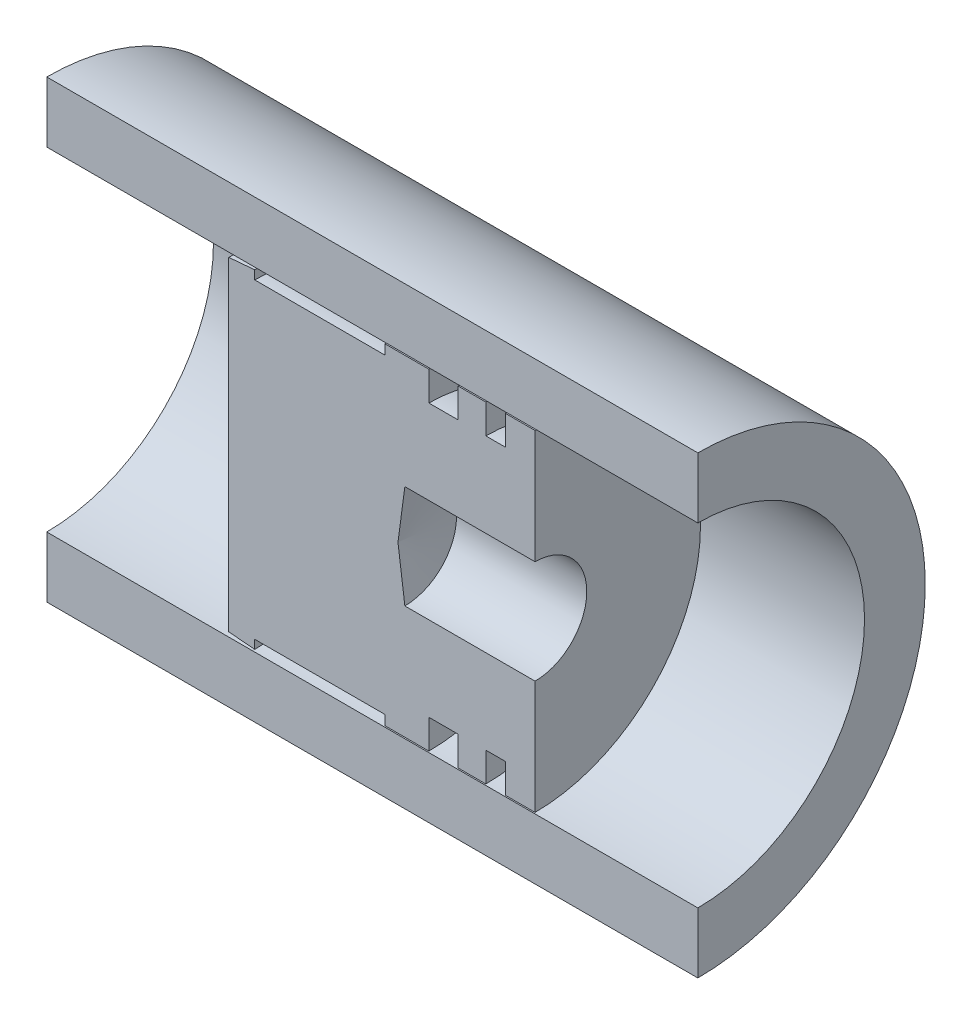
ISO-10303-21;
HEADER;
FILE_DESCRIPTION(('STEP AP214'),'2;1');
FILE_NAME('part.step','',(''),(''),'','','');
FILE_SCHEMA(('AUTOMOTIVE_DESIGN { 1 0 10303 214 1 1 1 1 }'));
ENDSEC;
DATA;
#1=APPLICATION_CONTEXT('core data for automotive mechanical design processes');
#2=APPLICATION_PROTOCOL_DEFINITION('international standard','automotive_design',2000,#1);
#3=PRODUCT_CONTEXT('',#1,'mechanical');
#4=PRODUCT('Part','Part','',(#3));
#5=PRODUCT_RELATED_PRODUCT_CATEGORY('part','',(#4));
#6=PRODUCT_DEFINITION_FORMATION('','',#4);
#7=PRODUCT_DEFINITION_CONTEXT('part definition',#1,'design');
#8=PRODUCT_DEFINITION('design','',#6,#7);
#9=PRODUCT_DEFINITION_SHAPE('','',#8);
#10=(LENGTH_UNIT() NAMED_UNIT(*) SI_UNIT(.MILLI.,.METRE.));
#11=(NAMED_UNIT(*) PLANE_ANGLE_UNIT() SI_UNIT($,.RADIAN.));
#12=(NAMED_UNIT(*) SI_UNIT($,.STERADIAN.) SOLID_ANGLE_UNIT());
#13=UNCERTAINTY_MEASURE_WITH_UNIT(LENGTH_MEASURE(1.E-05),#10,'distance_accuracy_value','');
#14=(GEOMETRIC_REPRESENTATION_CONTEXT(3) GLOBAL_UNCERTAINTY_ASSIGNED_CONTEXT((#13)) GLOBAL_UNIT_ASSIGNED_CONTEXT((#10,
#11,#12)) REPRESENTATION_CONTEXT('',''));
#15=CARTESIAN_POINT('',(0.,0.,0.));
#16=DIRECTION('',(0.,0.,1.));
#17=DIRECTION('',(1.,0.,0.));
#18=AXIS2_PLACEMENT_3D('',#15,#16,#17);
#19=CARTESIAN_POINT('',(-75.,34.925,0.));
#20=DIRECTION('',(1.,0.,0.));
#21=DIRECTION('',(0.,0.,-1.));
#22=AXIS2_PLACEMENT_3D('',#19,#20,#21);
#23=PLANE('',#22);
#24=DIRECTION('',(0.,-1.,0.));
#25=VECTOR('',#24,1.);
#26=CARTESIAN_POINT('',(-75.,34.925,0.));
#27=LINE('',#26,#25);
#28=CARTESIAN_POINT('',(-75.,34.925,0.));
#29=VERTEX_POINT('',#28);
#30=CARTESIAN_POINT('',(-75.,25.6,0.));
#31=VERTEX_POINT('',#30);
#32=EDGE_CURVE('E101',#29,#31,#27,.T.);
#33=ORIENTED_EDGE('',*,*,#32,.F.);
#34=CARTESIAN_POINT('',(-75.,0.,0.));
#35=DIRECTION('',(-1.,0.,0.));
#36=DIRECTION('',(0.,0.,1.));
#37=AXIS2_PLACEMENT_3D('',#34,#35,#36);
#38=CIRCLE('',#37,34.925);
#39=CARTESIAN_POINT('',(-75.,-34.925,0.));
#40=VERTEX_POINT('',#39);
#41=EDGE_CURVE('E98',#29,#40,#38,.T.);
#42=ORIENTED_EDGE('',*,*,#41,.T.);
#43=CARTESIAN_POINT('',(-75.,-25.6,0.));
#44=VERTEX_POINT('',#43);
#45=EDGE_CURVE('E64',#44,#40,#27,.T.);
#46=ORIENTED_EDGE('',*,*,#45,.F.);
#47=CARTESIAN_POINT('',(-75.,0.,0.));
#48=DIRECTION('',(-1.,0.,0.));
#49=DIRECTION('',(0.,0.,1.));
#50=AXIS2_PLACEMENT_3D('',#47,#48,#49);
#51=CIRCLE('',#50,25.6);
#52=EDGE_CURVE('E87',#31,#44,#51,.T.);
#53=ORIENTED_EDGE('',*,*,#52,.F.);
#54=EDGE_LOOP('',(#33,#42,#46,#53));
#55=FACE_BOUND('',#54,.T.);
#56=ADVANCED_FACE('F43',(#55),#23,.F.);
#57=CARTESIAN_POINT('',(-80.,0.,0.));
#58=DIRECTION('',(-1.,0.,0.));
#59=DIRECTION('',(0.,0.,1.));
#60=AXIS2_PLACEMENT_3D('',#57,#58,#59);
#61=CYLINDRICAL_SURFACE('',#60,25.6);
#62=DIRECTION('',(-1.,0.,0.));
#63=VECTOR('',#62,1.);
#64=CARTESIAN_POINT('',(-80.,25.6,0.));
#65=LINE('',#64,#63);
#66=CARTESIAN_POINT('',(25.,25.6,0.));
#67=VERTEX_POINT('',#66);
#68=EDGE_CURVE('E110',#31,#67,#65,.F.);
#69=ORIENTED_EDGE('',*,*,#68,.F.);
#70=ORIENTED_EDGE('',*,*,#52,.T.);
#71=DIRECTION('',(-1.,0.,0.));
#72=VECTOR('',#71,1.);
#73=CARTESIAN_POINT('',(-80.,-25.6,0.));
#74=LINE('',#73,#72);
#75=CARTESIAN_POINT('',(25.,-25.6,0.));
#76=VERTEX_POINT('',#75);
#77=EDGE_CURVE('E95',#76,#44,#74,.T.);
#78=ORIENTED_EDGE('',*,*,#77,.F.);
#79=CARTESIAN_POINT('',(25.,0.,0.));
#80=DIRECTION('',(-1.,0.,0.));
#81=DIRECTION('',(0.,0.,1.));
#82=AXIS2_PLACEMENT_3D('',#79,#80,#81);
#83=CIRCLE('',#82,25.6);
#84=EDGE_CURVE('E94',#67,#76,#83,.T.);
#85=ORIENTED_EDGE('',*,*,#84,.F.);
#86=EDGE_LOOP('',(#69,#70,#78,#85));
#87=FACE_BOUND('',#86,.T.);
#88=ADVANCED_FACE('F109',(#87),#61,.F.);
#89=CARTESIAN_POINT('',(25.,34.925,0.));
#90=DIRECTION('',(-1.,0.,0.));
#91=DIRECTION('',(0.,0.,1.));
#92=AXIS2_PLACEMENT_3D('',#89,#90,#91);
#93=PLANE('',#92);
#94=DIRECTION('',(0.,1.,0.));
#95=VECTOR('',#94,1.);
#96=CARTESIAN_POINT('',(25.,34.925,0.));
#97=LINE('',#96,#95);
#98=CARTESIAN_POINT('',(25.,-34.925,0.));
#99=VERTEX_POINT('',#98);
#100=EDGE_CURVE('E81',#99,#76,#97,.T.);
#101=ORIENTED_EDGE('',*,*,#100,.F.);
#102=CARTESIAN_POINT('',(25.,0.,0.));
#103=DIRECTION('',(-1.,0.,0.));
#104=DIRECTION('',(0.,0.,1.));
#105=AXIS2_PLACEMENT_3D('',#102,#103,#104);
#106=CIRCLE('',#105,34.925);
#107=CARTESIAN_POINT('',(25.,34.925,0.));
#108=VERTEX_POINT('',#107);
#109=EDGE_CURVE('E92',#108,#99,#106,.T.);
#110=ORIENTED_EDGE('',*,*,#109,.F.);
#111=EDGE_CURVE('E56',#67,#108,#97,.T.);
#112=ORIENTED_EDGE('',*,*,#111,.F.);
#113=ORIENTED_EDGE('',*,*,#84,.T.);
#114=EDGE_LOOP('',(#101,#110,#112,#113));
#115=FACE_BOUND('',#114,.T.);
#116=ADVANCED_FACE('F91',(#115),#93,.F.);
#117=CARTESIAN_POINT('',(-80.,0.,0.));
#118=DIRECTION('',(-1.,0.,0.));
#119=DIRECTION('',(0.,0.,1.));
#120=AXIS2_PLACEMENT_3D('',#117,#118,#119);
#121=CYLINDRICAL_SURFACE('',#120,34.925);
#122=DIRECTION('',(-1.,0.,0.));
#123=VECTOR('',#122,1.);
#124=CARTESIAN_POINT('',(-80.,34.925,0.));
#125=LINE('',#124,#123);
#126=EDGE_CURVE('E12',#108,#29,#125,.T.);
#127=ORIENTED_EDGE('',*,*,#126,.F.);
#128=ORIENTED_EDGE('',*,*,#109,.T.);
#129=DIRECTION('',(-1.,0.,0.));
#130=VECTOR('',#129,1.);
#131=CARTESIAN_POINT('',(-80.,-34.925,0.));
#132=LINE('',#131,#130);
#133=EDGE_CURVE('E50',#40,#99,#132,.F.);
#134=ORIENTED_EDGE('',*,*,#133,.F.);
#135=ORIENTED_EDGE('',*,*,#41,.F.);
#136=EDGE_LOOP('',(#127,#128,#134,#135));
#137=FACE_BOUND('',#136,.T.);
#138=ADVANCED_FACE('F97',(#137),#121,.T.);
#139=CARTESIAN_POINT('',(0.,0.,0.));
#140=DIRECTION('',(0.,0.,1.));
#141=DIRECTION('',(1.,0.,0.));
#142=AXIS2_PLACEMENT_3D('',#139,#140,#141);
#143=PLANE('',#142);
#144=ORIENTED_EDGE('',*,*,#45,.T.);
#145=ORIENTED_EDGE('',*,*,#133,.T.);
#146=ORIENTED_EDGE('',*,*,#100,.T.);
#147=ORIENTED_EDGE('',*,*,#77,.T.);
#148=EDGE_LOOP('',(#144,#145,#146,#147));
#149=FACE_BOUND('',#148,.T.);
#150=ADVANCED_FACE('F80',(#149),#143,.T.);
#151=ORIENTED_EDGE('',*,*,#32,.T.);
#152=ORIENTED_EDGE('',*,*,#68,.T.);
#153=ORIENTED_EDGE('',*,*,#111,.T.);
#154=ORIENTED_EDGE('',*,*,#126,.T.);
#155=EDGE_LOOP('',(#151,#152,#153,#154));
#156=FACE_BOUND('',#155,.T.);
#157=ADVANCED_FACE('F115',(#156),#143,.T.);
#158=CLOSED_SHELL('',(#56,#88,#116,#138,#150,#157));
#159=MANIFOLD_SOLID_BREP('B2',#158);
#160=CARTESIAN_POINT('',(-47.06,0.,0.));
#161=DIRECTION('',(1.,0.,0.));
#162=DIRECTION('',(0.,0.,-1.));
#163=AXIS2_PLACEMENT_3D('',#160,#161,#162);
#164=PLANE('',#163);
#165=DIRECTION('',(0.,-1.,0.));
#166=VECTOR('',#165,1.);
#167=CARTESIAN_POINT('',(-47.06,0.,0.));
#168=LINE('',#167,#166);
#169=CARTESIAN_POINT('',(-47.06,24.9,0.));
#170=VERTEX_POINT('',#169);
#171=CARTESIAN_POINT('',(-47.06,-24.9,0.));
#172=VERTEX_POINT('',#171);
#173=EDGE_CURVE('E183',#170,#172,#168,.T.);
#174=ORIENTED_EDGE('',*,*,#173,.F.);
#175=CARTESIAN_POINT('',(-47.06,0.,0.));
#176=DIRECTION('',(-1.,0.,0.));
#177=DIRECTION('',(0.,0.,1.));
#178=AXIS2_PLACEMENT_3D('',#175,#176,#177);
#179=CIRCLE('',#178,24.9);
#180=EDGE_CURVE('E279',#170,#172,#179,.T.);
#181=ORIENTED_EDGE('',*,*,#180,.T.);
#182=EDGE_LOOP('',(#174,#181));
#183=FACE_BOUND('',#182,.T.);
#184=ADVANCED_FACE('F164',(#183),#164,.F.);
#185=CARTESIAN_POINT('',(-43.06,0.,0.));
#186=DIRECTION('',(1.,0.,0.));
#187=DIRECTION('',(0.,0.,-1.));
#188=AXIS2_PLACEMENT_3D('',#185,#186,#187);
#189=CONICAL_SURFACE('',#188,25.25,0.0872777129494621);
#190=DIRECTION('',(0.996193717496113,-0.0871669502809106,0.));
#191=VECTOR('',#190,1.);
#192=CARTESIAN_POINT('',(-331.631428571426,0.,0.));
#193=LINE('',#192,#191);
#194=CARTESIAN_POINT('',(-43.06,-25.25,0.));
#195=VERTEX_POINT('',#194);
#196=EDGE_CURVE('E295',#172,#195,#193,.T.);
#197=ORIENTED_EDGE('',*,*,#196,.F.);
#198=ORIENTED_EDGE('',*,*,#180,.F.);
#199=DIRECTION('',(-0.996193717496113,-0.0871669502809106,0.));
#200=VECTOR('',#199,1.);
#201=CARTESIAN_POINT('',(-331.631428571426,0.,0.));
#202=LINE('',#201,#200);
#203=CARTESIAN_POINT('',(-43.06,25.25,0.));
#204=VERTEX_POINT('',#203);
#205=EDGE_CURVE('E343',#204,#170,#202,.T.);
#206=ORIENTED_EDGE('',*,*,#205,.F.);
#207=CARTESIAN_POINT('',(-43.06,0.,0.));
#208=DIRECTION('',(-1.,0.,0.));
#209=DIRECTION('',(0.,0.,1.));
#210=AXIS2_PLACEMENT_3D('',#207,#208,#209);
#211=CIRCLE('',#210,25.25);
#212=EDGE_CURVE('E334',#204,#195,#211,.T.);
#213=ORIENTED_EDGE('',*,*,#212,.T.);
#214=EDGE_LOOP('',(#197,#198,#206,#213));
#215=FACE_BOUND('',#214,.T.);
#216=ADVANCED_FACE('F342',(#215),#189,.T.);
#217=CARTESIAN_POINT('',(-43.06,25.25,0.));
#218=DIRECTION('',(-1.,0.,0.));
#219=DIRECTION('',(0.,0.,1.));
#220=AXIS2_PLACEMENT_3D('',#217,#218,#219);
#221=PLANE('',#220);
#222=DIRECTION('',(0.,1.,0.));
#223=VECTOR('',#222,1.);
#224=CARTESIAN_POINT('',(-43.06,25.25,0.));
#225=LINE('',#224,#223);
#226=CARTESIAN_POINT('',(-43.06,-23.9,0.));
#227=VERTEX_POINT('',#226);
#228=EDGE_CURVE('E346',#195,#227,#225,.T.);
#229=ORIENTED_EDGE('',*,*,#228,.F.);
#230=ORIENTED_EDGE('',*,*,#212,.F.);
#231=CARTESIAN_POINT('',(-43.06,23.9,0.));
#232=VERTEX_POINT('',#231);
#233=EDGE_CURVE('E349',#232,#204,#225,.T.);
#234=ORIENTED_EDGE('',*,*,#233,.F.);
#235=CARTESIAN_POINT('',(-43.06,0.,0.));
#236=DIRECTION('',(-1.,0.,0.));
#237=DIRECTION('',(0.,0.,1.));
#238=AXIS2_PLACEMENT_3D('',#235,#236,#237);
#239=CIRCLE('',#238,23.9);
#240=EDGE_CURVE('E331',#232,#227,#239,.T.);
#241=ORIENTED_EDGE('',*,*,#240,.T.);
#242=EDGE_LOOP('',(#229,#230,#234,#241));
#243=FACE_BOUND('',#242,.T.);
#244=ADVANCED_FACE('F453',(#243),#221,.F.);
#245=CARTESIAN_POINT('',(-47.06,0.,0.));
#246=DIRECTION('',(-1.,0.,0.));
#247=DIRECTION('',(0.,0.,1.));
#248=AXIS2_PLACEMENT_3D('',#245,#246,#247);
#249=CYLINDRICAL_SURFACE('',#248,23.9);
#250=DIRECTION('',(-1.,0.,0.));
#251=VECTOR('',#250,1.);
#252=CARTESIAN_POINT('',(-47.06,23.9,0.));
#253=LINE('',#252,#251);
#254=CARTESIAN_POINT('',(-23.06,23.9,0.));
#255=VERTEX_POINT('',#254);
#256=EDGE_CURVE('E351',#255,#232,#253,.T.);
#257=ORIENTED_EDGE('',*,*,#256,.F.);
#258=CARTESIAN_POINT('',(-23.06,0.,0.));
#259=DIRECTION('',(-1.,0.,0.));
#260=DIRECTION('',(0.,0.,1.));
#261=AXIS2_PLACEMENT_3D('',#258,#259,#260);
#262=CIRCLE('',#261,23.9);
#263=CARTESIAN_POINT('',(-23.06,-23.9,0.));
#264=VERTEX_POINT('',#263);
#265=EDGE_CURVE('E328',#255,#264,#262,.T.);
#266=ORIENTED_EDGE('',*,*,#265,.T.);
#267=DIRECTION('',(-1.,0.,0.));
#268=VECTOR('',#267,1.);
#269=CARTESIAN_POINT('',(-47.06,-23.9,0.));
#270=LINE('',#269,#268);
#271=EDGE_CURVE('E353',#227,#264,#270,.F.);
#272=ORIENTED_EDGE('',*,*,#271,.F.);
#273=ORIENTED_EDGE('',*,*,#240,.F.);
#274=EDGE_LOOP('',(#257,#266,#272,#273));
#275=FACE_BOUND('',#274,.T.);
#276=ADVANCED_FACE('F450',(#275),#249,.T.);
#277=CARTESIAN_POINT('',(-23.06,25.4,0.));
#278=DIRECTION('',(1.,0.,0.));
#279=DIRECTION('',(0.,0.,-1.));
#280=AXIS2_PLACEMENT_3D('',#277,#278,#279);
#281=PLANE('',#280);
#282=DIRECTION('',(0.,-1.,0.));
#283=VECTOR('',#282,1.);
#284=CARTESIAN_POINT('',(-23.06,25.4,0.));
#285=LINE('',#284,#283);
#286=CARTESIAN_POINT('',(-23.06,25.4,0.));
#287=VERTEX_POINT('',#286);
#288=EDGE_CURVE('E355',#287,#255,#285,.T.);
#289=ORIENTED_EDGE('',*,*,#288,.F.);
#290=CARTESIAN_POINT('',(-23.06,0.,0.));
#291=DIRECTION('',(-1.,0.,0.));
#292=DIRECTION('',(0.,0.,1.));
#293=AXIS2_PLACEMENT_3D('',#290,#291,#292);
#294=CIRCLE('',#293,25.4);
#295=CARTESIAN_POINT('',(-23.06,-25.4,0.));
#296=VERTEX_POINT('',#295);
#297=EDGE_CURVE('E325',#287,#296,#294,.T.);
#298=ORIENTED_EDGE('',*,*,#297,.T.);
#299=EDGE_CURVE('E356',#264,#296,#285,.T.);
#300=ORIENTED_EDGE('',*,*,#299,.F.);
#301=ORIENTED_EDGE('',*,*,#265,.F.);
#302=EDGE_LOOP('',(#289,#298,#300,#301));
#303=FACE_BOUND('',#302,.T.);
#304=ADVANCED_FACE('F444',(#303),#281,.F.);
#305=CARTESIAN_POINT('',(-47.06,0.,0.));
#306=DIRECTION('',(-1.,0.,0.));
#307=DIRECTION('',(0.,0.,1.));
#308=AXIS2_PLACEMENT_3D('',#305,#306,#307);
#309=CYLINDRICAL_SURFACE('',#308,25.4);
#310=DIRECTION('',(-1.,0.,0.));
#311=VECTOR('',#310,1.);
#312=CARTESIAN_POINT('',(-47.06,25.4,0.));
#313=LINE('',#312,#311);
#314=CARTESIAN_POINT('',(-16.31,25.4,0.));
#315=VERTEX_POINT('',#314);
#316=EDGE_CURVE('E358',#315,#287,#313,.T.);
#317=ORIENTED_EDGE('',*,*,#316,.F.);
#318=CARTESIAN_POINT('',(-16.31,0.,0.));
#319=DIRECTION('',(-1.,0.,0.));
#320=DIRECTION('',(0.,0.,1.));
#321=AXIS2_PLACEMENT_3D('',#318,#319,#320);
#322=CIRCLE('',#321,25.4);
#323=CARTESIAN_POINT('',(-16.31,-25.4,0.));
#324=VERTEX_POINT('',#323);
#325=EDGE_CURVE('E322',#315,#324,#322,.T.);
#326=ORIENTED_EDGE('',*,*,#325,.T.);
#327=DIRECTION('',(-1.,0.,0.));
#328=VECTOR('',#327,1.);
#329=CARTESIAN_POINT('',(-47.06,-25.4,0.));
#330=LINE('',#329,#328);
#331=EDGE_CURVE('E360',#296,#324,#330,.F.);
#332=ORIENTED_EDGE('',*,*,#331,.F.);
#333=ORIENTED_EDGE('',*,*,#297,.F.);
#334=EDGE_LOOP('',(#317,#326,#332,#333));
#335=FACE_BOUND('',#334,.T.);
#336=ADVANCED_FACE('F440',(#335),#309,.T.);
#337=CARTESIAN_POINT('',(-16.31,25.4,0.));
#338=DIRECTION('',(-1.,0.,0.));
#339=DIRECTION('',(0.,0.,1.));
#340=AXIS2_PLACEMENT_3D('',#337,#338,#339);
#341=PLANE('',#340);
#342=DIRECTION('',(0.,1.,0.));
#343=VECTOR('',#342,1.);
#344=CARTESIAN_POINT('',(-16.31,25.4,0.));
#345=LINE('',#344,#343);
#346=CARTESIAN_POINT('',(-16.31,-20.9,0.));
#347=VERTEX_POINT('',#346);
#348=EDGE_CURVE('E362',#324,#347,#345,.T.);
#349=ORIENTED_EDGE('',*,*,#348,.F.);
#350=ORIENTED_EDGE('',*,*,#325,.F.);
#351=CARTESIAN_POINT('',(-16.31,20.9,0.));
#352=VERTEX_POINT('',#351);
#353=EDGE_CURVE('E363',#352,#315,#345,.T.);
#354=ORIENTED_EDGE('',*,*,#353,.F.);
#355=CARTESIAN_POINT('',(-16.31,0.,0.));
#356=DIRECTION('',(-1.,0.,0.));
#357=DIRECTION('',(0.,0.,1.));
#358=AXIS2_PLACEMENT_3D('',#355,#356,#357);
#359=CIRCLE('',#358,20.9);
#360=EDGE_CURVE('E319',#352,#347,#359,.T.);
#361=ORIENTED_EDGE('',*,*,#360,.T.);
#362=EDGE_LOOP('',(#349,#350,#354,#361));
#363=FACE_BOUND('',#362,.T.);
#364=ADVANCED_FACE('F434',(#363),#341,.F.);
#365=CARTESIAN_POINT('',(-47.06,0.,0.));
#366=DIRECTION('',(-1.,0.,0.));
#367=DIRECTION('',(0.,0.,1.));
#368=AXIS2_PLACEMENT_3D('',#365,#366,#367);
#369=CYLINDRICAL_SURFACE('',#368,20.9);
#370=DIRECTION('',(-1.,0.,0.));
#371=VECTOR('',#370,1.);
#372=CARTESIAN_POINT('',(-47.06,20.9,0.));
#373=LINE('',#372,#371);
#374=CARTESIAN_POINT('',(-11.81,20.9,0.));
#375=VERTEX_POINT('',#374);
#376=EDGE_CURVE('E365',#375,#352,#373,.T.);
#377=ORIENTED_EDGE('',*,*,#376,.F.);
#378=CARTESIAN_POINT('',(-11.81,0.,0.));
#379=DIRECTION('',(-1.,0.,0.));
#380=DIRECTION('',(0.,0.,1.));
#381=AXIS2_PLACEMENT_3D('',#378,#379,#380);
#382=CIRCLE('',#381,20.9);
#383=CARTESIAN_POINT('',(-11.81,-20.9,0.));
#384=VERTEX_POINT('',#383);
#385=EDGE_CURVE('E316',#375,#384,#382,.T.);
#386=ORIENTED_EDGE('',*,*,#385,.T.);
#387=DIRECTION('',(-1.,0.,0.));
#388=VECTOR('',#387,1.);
#389=CARTESIAN_POINT('',(-47.06,-20.9,0.));
#390=LINE('',#389,#388);
#391=EDGE_CURVE('E367',#347,#384,#390,.F.);
#392=ORIENTED_EDGE('',*,*,#391,.F.);
#393=ORIENTED_EDGE('',*,*,#360,.F.);
#394=EDGE_LOOP('',(#377,#386,#392,#393));
#395=FACE_BOUND('',#394,.T.);
#396=ADVANCED_FACE('F430',(#395),#369,.T.);
#397=CARTESIAN_POINT('',(-11.81,20.9,0.));
#398=DIRECTION('',(1.,0.,0.));
#399=DIRECTION('',(0.,0.,-1.));
#400=AXIS2_PLACEMENT_3D('',#397,#398,#399);
#401=PLANE('',#400);
#402=DIRECTION('',(0.,-1.,0.));
#403=VECTOR('',#402,1.);
#404=CARTESIAN_POINT('',(-11.81,20.9,0.));
#405=LINE('',#404,#403);
#406=CARTESIAN_POINT('',(-11.81,25.4,0.));
#407=VERTEX_POINT('',#406);
#408=EDGE_CURVE('E369',#407,#375,#405,.T.);
#409=ORIENTED_EDGE('',*,*,#408,.F.);
#410=CARTESIAN_POINT('',(-11.81,0.,0.));
#411=DIRECTION('',(-1.,0.,0.));
#412=DIRECTION('',(0.,0.,1.));
#413=AXIS2_PLACEMENT_3D('',#410,#411,#412);
#414=CIRCLE('',#413,25.4);
#415=CARTESIAN_POINT('',(-11.81,-25.4,0.));
#416=VERTEX_POINT('',#415);
#417=EDGE_CURVE('E313',#407,#416,#414,.T.);
#418=ORIENTED_EDGE('',*,*,#417,.T.);
#419=EDGE_CURVE('E370',#384,#416,#405,.T.);
#420=ORIENTED_EDGE('',*,*,#419,.F.);
#421=ORIENTED_EDGE('',*,*,#385,.F.);
#422=EDGE_LOOP('',(#409,#418,#420,#421));
#423=FACE_BOUND('',#422,.T.);
#424=ADVANCED_FACE('F424',(#423),#401,.F.);
#425=CARTESIAN_POINT('',(-47.06,0.,0.));
#426=DIRECTION('',(-1.,0.,0.));
#427=DIRECTION('',(0.,0.,1.));
#428=AXIS2_PLACEMENT_3D('',#425,#426,#427);
#429=CYLINDRICAL_SURFACE('',#428,25.4);
#430=DIRECTION('',(-1.,0.,0.));
#431=VECTOR('',#430,1.);
#432=CARTESIAN_POINT('',(-47.06,25.4,0.));
#433=LINE('',#432,#431);
#434=CARTESIAN_POINT('',(-7.56000000000001,25.4,0.));
#435=VERTEX_POINT('',#434);
#436=EDGE_CURVE('E372',#435,#407,#433,.T.);
#437=ORIENTED_EDGE('',*,*,#436,.F.);
#438=CARTESIAN_POINT('',(-7.56000000000001,0.,0.));
#439=DIRECTION('',(-1.,0.,0.));
#440=DIRECTION('',(0.,0.,1.));
#441=AXIS2_PLACEMENT_3D('',#438,#439,#440);
#442=CIRCLE('',#441,25.4);
#443=CARTESIAN_POINT('',(-7.56000000000001,-25.4,0.));
#444=VERTEX_POINT('',#443);
#445=EDGE_CURVE('E310',#435,#444,#442,.T.);
#446=ORIENTED_EDGE('',*,*,#445,.T.);
#447=DIRECTION('',(-1.,0.,0.));
#448=VECTOR('',#447,1.);
#449=CARTESIAN_POINT('',(-47.06,-25.4,0.));
#450=LINE('',#449,#448);
#451=EDGE_CURVE('E374',#416,#444,#450,.F.);
#452=ORIENTED_EDGE('',*,*,#451,.F.);
#453=ORIENTED_EDGE('',*,*,#417,.F.);
#454=EDGE_LOOP('',(#437,#446,#452,#453));
#455=FACE_BOUND('',#454,.T.);
#456=ADVANCED_FACE('F420',(#455),#429,.T.);
#457=CARTESIAN_POINT('',(-7.56000000000001,25.4,0.));
#458=DIRECTION('',(-1.,0.,0.));
#459=DIRECTION('',(0.,0.,1.));
#460=AXIS2_PLACEMENT_3D('',#457,#458,#459);
#461=PLANE('',#460);
#462=DIRECTION('',(0.,1.,0.));
#463=VECTOR('',#462,1.);
#464=CARTESIAN_POINT('',(-7.56000000000001,25.4,0.));
#465=LINE('',#464,#463);
#466=CARTESIAN_POINT('',(-7.56000000000001,-20.9,0.));
#467=VERTEX_POINT('',#466);
#468=EDGE_CURVE('E376',#444,#467,#465,.T.);
#469=ORIENTED_EDGE('',*,*,#468,.F.);
#470=ORIENTED_EDGE('',*,*,#445,.F.);
#471=CARTESIAN_POINT('',(-7.56000000000001,20.9,0.));
#472=VERTEX_POINT('',#471);
#473=EDGE_CURVE('E377',#472,#435,#465,.T.);
#474=ORIENTED_EDGE('',*,*,#473,.F.);
#475=CARTESIAN_POINT('',(-7.56000000000001,0.,0.));
#476=DIRECTION('',(-1.,0.,0.));
#477=DIRECTION('',(0.,0.,1.));
#478=AXIS2_PLACEMENT_3D('',#475,#476,#477);
#479=CIRCLE('',#478,20.9);
#480=EDGE_CURVE('E307',#472,#467,#479,.T.);
#481=ORIENTED_EDGE('',*,*,#480,.T.);
#482=EDGE_LOOP('',(#469,#470,#474,#481));
#483=FACE_BOUND('',#482,.T.);
#484=ADVANCED_FACE('F414',(#483),#461,.F.);
#485=CARTESIAN_POINT('',(-47.06,0.,0.));
#486=DIRECTION('',(-1.,0.,0.));
#487=DIRECTION('',(0.,0.,1.));
#488=AXIS2_PLACEMENT_3D('',#485,#486,#487);
#489=CYLINDRICAL_SURFACE('',#488,20.9);
#490=DIRECTION('',(-1.,0.,0.));
#491=VECTOR('',#490,1.);
#492=CARTESIAN_POINT('',(-47.06,20.9,0.));
#493=LINE('',#492,#491);
#494=CARTESIAN_POINT('',(-4.56000000000002,20.9,0.));
#495=VERTEX_POINT('',#494);
#496=EDGE_CURVE('E379',#495,#472,#493,.T.);
#497=ORIENTED_EDGE('',*,*,#496,.F.);
#498=CARTESIAN_POINT('',(-4.56000000000002,0.,0.));
#499=DIRECTION('',(-1.,0.,0.));
#500=DIRECTION('',(0.,0.,1.));
#501=AXIS2_PLACEMENT_3D('',#498,#499,#500);
#502=CIRCLE('',#501,20.9);
#503=CARTESIAN_POINT('',(-4.56000000000002,-20.9,0.));
#504=VERTEX_POINT('',#503);
#505=EDGE_CURVE('E304',#495,#504,#502,.T.);
#506=ORIENTED_EDGE('',*,*,#505,.T.);
#507=DIRECTION('',(-1.,0.,0.));
#508=VECTOR('',#507,1.);
#509=CARTESIAN_POINT('',(-47.06,-20.9,0.));
#510=LINE('',#509,#508);
#511=EDGE_CURVE('E381',#467,#504,#510,.F.);
#512=ORIENTED_EDGE('',*,*,#511,.F.);
#513=ORIENTED_EDGE('',*,*,#480,.F.);
#514=EDGE_LOOP('',(#497,#506,#512,#513));
#515=FACE_BOUND('',#514,.T.);
#516=ADVANCED_FACE('F410',(#515),#489,.T.);
#517=CARTESIAN_POINT('',(-4.56000000000001,20.9,0.));
#518=DIRECTION('',(1.,0.,0.));
#519=DIRECTION('',(0.,0.,-1.));
#520=AXIS2_PLACEMENT_3D('',#517,#518,#519);
#521=PLANE('',#520);
#522=DIRECTION('',(0.,-1.,0.));
#523=VECTOR('',#522,1.);
#524=CARTESIAN_POINT('',(-4.56000000000001,20.9,0.));
#525=LINE('',#524,#523);
#526=CARTESIAN_POINT('',(-4.56000000000002,25.4,0.));
#527=VERTEX_POINT('',#526);
#528=EDGE_CURVE('E383',#527,#495,#525,.T.);
#529=ORIENTED_EDGE('',*,*,#528,.F.);
#530=CARTESIAN_POINT('',(-4.56000000000002,0.,0.));
#531=DIRECTION('',(-1.,0.,0.));
#532=DIRECTION('',(0.,0.,1.));
#533=AXIS2_PLACEMENT_3D('',#530,#531,#532);
#534=CIRCLE('',#533,25.4);
#535=CARTESIAN_POINT('',(-4.56000000000002,-25.4,0.));
#536=VERTEX_POINT('',#535);
#537=EDGE_CURVE('E301',#527,#536,#534,.T.);
#538=ORIENTED_EDGE('',*,*,#537,.T.);
#539=EDGE_CURVE('E384',#504,#536,#525,.T.);
#540=ORIENTED_EDGE('',*,*,#539,.F.);
#541=ORIENTED_EDGE('',*,*,#505,.F.);
#542=EDGE_LOOP('',(#529,#538,#540,#541));
#543=FACE_BOUND('',#542,.T.);
#544=ADVANCED_FACE('F404',(#543),#521,.F.);
#545=CARTESIAN_POINT('',(-47.06,0.,0.));
#546=DIRECTION('',(-1.,0.,0.));
#547=DIRECTION('',(0.,0.,1.));
#548=AXIS2_PLACEMENT_3D('',#545,#546,#547);
#549=CYLINDRICAL_SURFACE('',#548,25.4);
#550=DIRECTION('',(-1.,0.,0.));
#551=VECTOR('',#550,1.);
#552=CARTESIAN_POINT('',(-47.06,25.4,0.));
#553=LINE('',#552,#551);
#554=CARTESIAN_POINT('',(0.,25.4,0.));
#555=VERTEX_POINT('',#554);
#556=EDGE_CURVE('E386',#555,#527,#553,.T.);
#557=ORIENTED_EDGE('',*,*,#556,.F.);
#558=CARTESIAN_POINT('',(0.,0.,0.));
#559=DIRECTION('',(-1.,0.,0.));
#560=DIRECTION('',(0.,0.,1.));
#561=AXIS2_PLACEMENT_3D('',#558,#559,#560);
#562=CIRCLE('',#561,25.4);
#563=CARTESIAN_POINT('',(0.,-25.4,0.));
#564=VERTEX_POINT('',#563);
#565=EDGE_CURVE('E293',#555,#564,#562,.T.);
#566=ORIENTED_EDGE('',*,*,#565,.T.);
#567=DIRECTION('',(-1.,0.,0.));
#568=VECTOR('',#567,1.);
#569=CARTESIAN_POINT('',(-47.06,-25.4,0.));
#570=LINE('',#569,#568);
#571=EDGE_CURVE('E388',#536,#564,#570,.F.);
#572=ORIENTED_EDGE('',*,*,#571,.F.);
#573=ORIENTED_EDGE('',*,*,#537,.F.);
#574=EDGE_LOOP('',(#557,#566,#572,#573));
#575=FACE_BOUND('',#574,.T.);
#576=ADVANCED_FACE('F400',(#575),#549,.T.);
#577=CARTESIAN_POINT('',(0.,7.9375,0.));
#578=DIRECTION('',(-1.,0.,0.));
#579=DIRECTION('',(0.,0.,1.));
#580=AXIS2_PLACEMENT_3D('',#577,#578,#579);
#581=PLANE('',#580);
#582=DIRECTION('',(0.,1.,0.));
#583=VECTOR('',#582,1.);
#584=CARTESIAN_POINT('',(0.,7.9375,0.));
#585=LINE('',#584,#583);
#586=CARTESIAN_POINT('',(0.,-7.9375,0.));
#587=VERTEX_POINT('',#586);
#588=EDGE_CURVE('E390',#564,#587,#585,.T.);
#589=ORIENTED_EDGE('',*,*,#588,.F.);
#590=ORIENTED_EDGE('',*,*,#565,.F.);
#591=CARTESIAN_POINT('',(0.,7.9375,0.));
#592=VERTEX_POINT('',#591);
#593=EDGE_CURVE('E288',#592,#555,#585,.T.);
#594=ORIENTED_EDGE('',*,*,#593,.F.);
#595=CARTESIAN_POINT('',(0.,0.,0.));
#596=DIRECTION('',(-1.,0.,0.));
#597=DIRECTION('',(0.,0.,1.));
#598=AXIS2_PLACEMENT_3D('',#595,#596,#597);
#599=CIRCLE('',#598,7.9375);
#600=EDGE_CURVE('E287',#592,#587,#599,.T.);
#601=ORIENTED_EDGE('',*,*,#600,.T.);
#602=EDGE_LOOP('',(#589,#590,#594,#601));
#603=FACE_BOUND('',#602,.T.);
#604=ADVANCED_FACE('F394',(#603),#581,.F.);
#605=CARTESIAN_POINT('',(-47.06,0.,0.));
#606=DIRECTION('',(-1.,0.,0.));
#607=DIRECTION('',(0.,0.,1.));
#608=AXIS2_PLACEMENT_3D('',#605,#606,#607);
#609=CYLINDRICAL_SURFACE('',#608,7.9375);
#610=DIRECTION('',(-1.,0.,0.));
#611=VECTOR('',#610,1.);
#612=CARTESIAN_POINT('',(-47.06,7.9375,0.));
#613=LINE('',#612,#611);
#614=CARTESIAN_POINT('',(-20.,7.9375,0.));
#615=VERTEX_POINT('',#614);
#616=EDGE_CURVE('E275',#615,#592,#613,.F.);
#617=ORIENTED_EDGE('',*,*,#616,.F.);
#618=CARTESIAN_POINT('',(-20.,0.,0.));
#619=DIRECTION('',(-1.,0.,0.));
#620=DIRECTION('',(0.,0.,1.));
#621=AXIS2_PLACEMENT_3D('',#618,#619,#620);
#622=CIRCLE('',#621,7.9375);
#623=CARTESIAN_POINT('',(-20.,-7.9375,0.));
#624=VERTEX_POINT('',#623);
#625=EDGE_CURVE('E285',#615,#624,#622,.T.);
#626=ORIENTED_EDGE('',*,*,#625,.T.);
#627=DIRECTION('',(-1.,0.,0.));
#628=VECTOR('',#627,1.);
#629=CARTESIAN_POINT('',(-47.06,-7.9375,0.));
#630=LINE('',#629,#628);
#631=EDGE_CURVE('E289',#587,#624,#630,.T.);
#632=ORIENTED_EDGE('',*,*,#631,.F.);
#633=ORIENTED_EDGE('',*,*,#600,.F.);
#634=EDGE_LOOP('',(#617,#626,#632,#633));
#635=FACE_BOUND('',#634,.T.);
#636=ADVANCED_FACE('F283',(#635),#609,.F.);
#637=CARTESIAN_POINT('',(-21.06,0.,0.));
#638=DIRECTION('',(1.,0.,0.));
#639=DIRECTION('',(0.,0.,-1.));
#640=AXIS2_PLACEMENT_3D('',#637,#638,#639);
#641=CONICAL_SURFACE('',#640,0.,1.43803849408648);
#642=DIRECTION('',(0.132368208001171,-0.991200614159696,0.));
#643=VECTOR('',#642,1.);
#644=CARTESIAN_POINT('',(-21.06,0.,0.));
#645=LINE('',#644,#643);
#646=CARTESIAN_POINT('',(-21.06,0.,0.));
#647=VERTEX_POINT('',#646);
#648=EDGE_CURVE('E41',#624,#647,#645,.F.);
#649=ORIENTED_EDGE('',*,*,#648,.F.);
#650=ORIENTED_EDGE('',*,*,#625,.F.);
#651=DIRECTION('',(-0.132368208001171,-0.991200614159696,0.));
#652=VECTOR('',#651,1.);
#653=CARTESIAN_POINT('',(-21.06,0.,0.));
#654=LINE('',#653,#652);
#655=EDGE_CURVE('E171',#647,#615,#654,.F.);
#656=ORIENTED_EDGE('',*,*,#655,.F.);
#657=EDGE_LOOP('',(#649,#650,#656));
#658=FACE_BOUND('',#657,.T.);
#659=ADVANCED_FACE('F291',(#658),#641,.F.);
#660=CARTESIAN_POINT('',(0.,0.,0.));
#661=DIRECTION('',(0.,0.,1.));
#662=DIRECTION('',(1.,0.,0.));
#663=AXIS2_PLACEMENT_3D('',#660,#661,#662);
#664=PLANE('',#663);
#665=ORIENTED_EDGE('',*,*,#173,.T.);
#666=ORIENTED_EDGE('',*,*,#196,.T.);
#667=ORIENTED_EDGE('',*,*,#228,.T.);
#668=ORIENTED_EDGE('',*,*,#271,.T.);
#669=ORIENTED_EDGE('',*,*,#299,.T.);
#670=ORIENTED_EDGE('',*,*,#331,.T.);
#671=ORIENTED_EDGE('',*,*,#348,.T.);
#672=ORIENTED_EDGE('',*,*,#391,.T.);
#673=ORIENTED_EDGE('',*,*,#419,.T.);
#674=ORIENTED_EDGE('',*,*,#451,.T.);
#675=ORIENTED_EDGE('',*,*,#468,.T.);
#676=ORIENTED_EDGE('',*,*,#511,.T.);
#677=ORIENTED_EDGE('',*,*,#539,.T.);
#678=ORIENTED_EDGE('',*,*,#571,.T.);
#679=ORIENTED_EDGE('',*,*,#588,.T.);
#680=ORIENTED_EDGE('',*,*,#631,.T.);
#681=ORIENTED_EDGE('',*,*,#648,.T.);
#682=ORIENTED_EDGE('',*,*,#655,.T.);
#683=ORIENTED_EDGE('',*,*,#616,.T.);
#684=ORIENTED_EDGE('',*,*,#593,.T.);
#685=ORIENTED_EDGE('',*,*,#556,.T.);
#686=ORIENTED_EDGE('',*,*,#528,.T.);
#687=ORIENTED_EDGE('',*,*,#496,.T.);
#688=ORIENTED_EDGE('',*,*,#473,.T.);
#689=ORIENTED_EDGE('',*,*,#436,.T.);
#690=ORIENTED_EDGE('',*,*,#408,.T.);
#691=ORIENTED_EDGE('',*,*,#376,.T.);
#692=ORIENTED_EDGE('',*,*,#353,.T.);
#693=ORIENTED_EDGE('',*,*,#316,.T.);
#694=ORIENTED_EDGE('',*,*,#288,.T.);
#695=ORIENTED_EDGE('',*,*,#256,.T.);
#696=ORIENTED_EDGE('',*,*,#233,.T.);
#697=ORIENTED_EDGE('',*,*,#205,.T.);
#698=EDGE_LOOP('',(#665,#666,#667,#668,#669,#670,#671,#672,#673,#674,#675,#676,#677,#678,#679,
#680,#681,#682,#683,#684,#685,#686,#687,#688,#689,#690,#691,#692,#693,#694,#695,#696,#697));
#699=FACE_BOUND('',#698,.T.);
#700=ADVANCED_FACE('F274',(#699),#664,.T.);
#701=CLOSED_SHELL('',(#184,#216,#244,#276,#304,#336,#364,#396,#424,#456,#484,#516,#544,#576,
#604,#636,#659,#700));
#702=MANIFOLD_SOLID_BREP('B6',#701);
#703=ADVANCED_BREP_SHAPE_REPRESENTATION('',(#18,#159,#702),#14);
#704=SHAPE_DEFINITION_REPRESENTATION(#9,#703);
ENDSEC;
END-ISO-10303-21;
